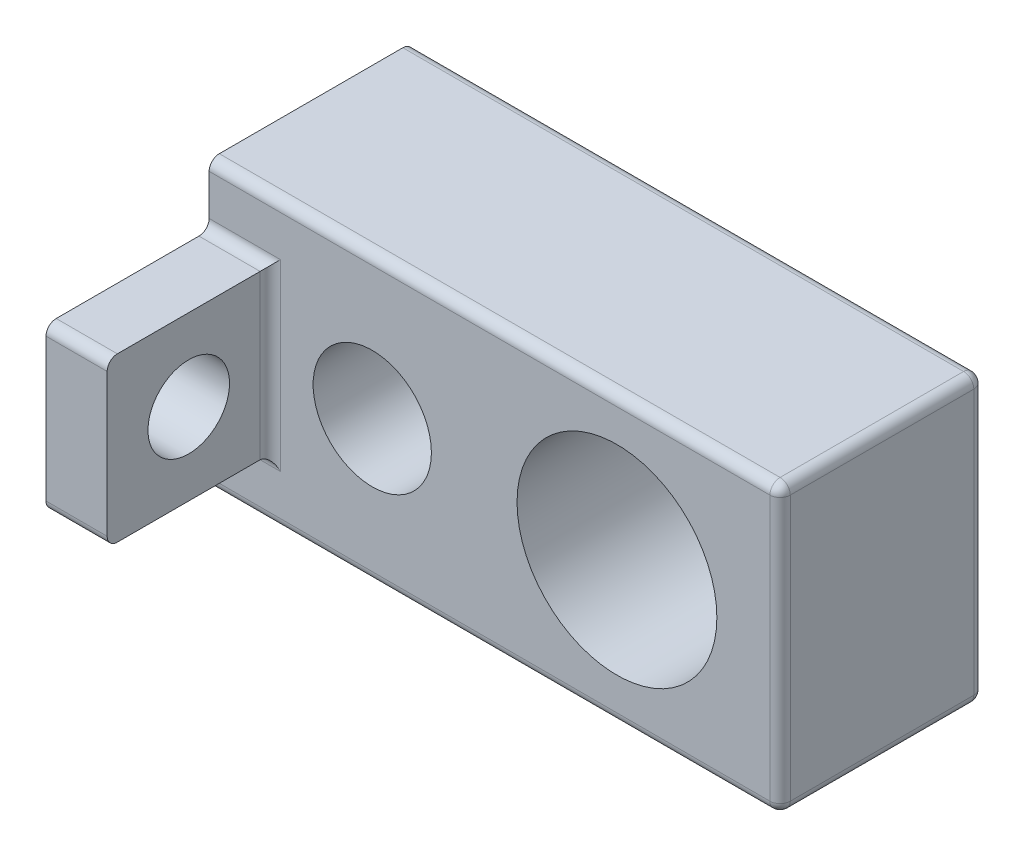
ISO-10303-21;
HEADER;
FILE_DESCRIPTION(('STEP AP214'),'2;1');
FILE_NAME('part.step','',(''),(''),'','','');
FILE_SCHEMA(('AUTOMOTIVE_DESIGN { 1 0 10303 214 1 1 1 1 }'));
ENDSEC;
DATA;
#1=APPLICATION_CONTEXT('core data for automotive mechanical design processes');
#2=APPLICATION_PROTOCOL_DEFINITION('international standard','automotive_design',2000,#1);
#3=PRODUCT_CONTEXT('',#1,'mechanical');
#4=PRODUCT('Part','Part','',(#3));
#5=PRODUCT_RELATED_PRODUCT_CATEGORY('part','',(#4));
#6=PRODUCT_DEFINITION_FORMATION('','',#4);
#7=PRODUCT_DEFINITION_CONTEXT('part definition',#1,'design');
#8=PRODUCT_DEFINITION('design','',#6,#7);
#9=PRODUCT_DEFINITION_SHAPE('','',#8);
#10=(LENGTH_UNIT() NAMED_UNIT(*) SI_UNIT(.MILLI.,.METRE.));
#11=(NAMED_UNIT(*) PLANE_ANGLE_UNIT() SI_UNIT($,.RADIAN.));
#12=(NAMED_UNIT(*) SI_UNIT($,.STERADIAN.) SOLID_ANGLE_UNIT());
#13=UNCERTAINTY_MEASURE_WITH_UNIT(LENGTH_MEASURE(1.E-05),#10,'distance_accuracy_value','');
#14=(GEOMETRIC_REPRESENTATION_CONTEXT(3) GLOBAL_UNCERTAINTY_ASSIGNED_CONTEXT((#13)) GLOBAL_UNIT_ASSIGNED_CONTEXT((#10,
#11,#12)) REPRESENTATION_CONTEXT('',''));
#15=CARTESIAN_POINT('',(0.,0.,0.));
#16=DIRECTION('',(0.,0.,1.));
#17=DIRECTION('',(1.,0.,0.));
#18=AXIS2_PLACEMENT_3D('',#15,#16,#17);
#19=CARTESIAN_POINT('',(-7.,-3.5,5.));
#20=DIRECTION('',(1.,0.,0.));
#21=DIRECTION('',(0.,0.,-1.));
#22=AXIS2_PLACEMENT_3D('',#19,#20,#21);
#23=PLANE('',#22);
#24=CARTESIAN_POINT('',(-7.,0.,7.));
#25=DIRECTION('',(1.,0.,0.));
#26=DIRECTION('',(0.,0.,-1.));
#27=AXIS2_PLACEMENT_3D('',#24,#25,#26);
#28=CIRCLE('',#27,1.);
#29=CARTESIAN_POINT('',(-7.,0.,6.));
#30=VERTEX_POINT('',#29);
#31=EDGE_CURVE('E409',#30,#30,#28,.T.);
#32=ORIENTED_EDGE('',*,*,#31,.T.);
#33=EDGE_LOOP('',(#32));
#34=FACE_BOUND('',#33,.T.);
#35=DIRECTION('',(0.,-1.,0.));
#36=VECTOR('',#35,1.);
#37=CARTESIAN_POINT('',(-7.,-3.5,0.));
#38=LINE('',#37,#36);
#39=CARTESIAN_POINT('',(-7.,3.25,0.));
#40=VERTEX_POINT('',#39);
#41=CARTESIAN_POINT('',(-7.,-3.25,0.));
#42=VERTEX_POINT('',#41);
#43=EDGE_CURVE('E344',#40,#42,#38,.T.);
#44=ORIENTED_EDGE('',*,*,#43,.T.);
#45=CARTESIAN_POINT('',(-7.,-3.25,0.25));
#46=DIRECTION('',(1.,0.,0.));
#47=DIRECTION('',(0.,0.,-1.));
#48=AXIS2_PLACEMENT_3D('',#45,#46,#47);
#49=CIRCLE('',#48,0.25);
#50=CARTESIAN_POINT('',(-7.,-3.5,0.25));
#51=VERTEX_POINT('',#50);
#52=EDGE_CURVE('E188',#42,#51,#49,.F.);
#53=ORIENTED_EDGE('',*,*,#52,.T.);
#54=DIRECTION('',(0.,0.,-1.));
#55=VECTOR('',#54,1.);
#56=CARTESIAN_POINT('',(-7.,-3.5,5.));
#57=LINE('',#56,#55);
#58=CARTESIAN_POINT('',(-7.,-3.5,4.75));
#59=VERTEX_POINT('',#58);
#60=EDGE_CURVE('E171',#59,#51,#57,.T.);
#61=ORIENTED_EDGE('',*,*,#60,.F.);
#62=CARTESIAN_POINT('',(-7.,-3.25,4.75));
#63=DIRECTION('',(1.,0.,0.));
#64=DIRECTION('',(0.,0.,-1.));
#65=AXIS2_PLACEMENT_3D('',#62,#63,#64);
#66=CIRCLE('',#65,0.25);
#67=CARTESIAN_POINT('',(-7.,-3.25,5.));
#68=VERTEX_POINT('',#67);
#69=EDGE_CURVE('E185',#59,#68,#66,.F.);
#70=ORIENTED_EDGE('',*,*,#69,.T.);
#71=DIRECTION('',(0.,-1.,0.));
#72=VECTOR('',#71,1.);
#73=CARTESIAN_POINT('',(-7.,-3.5,5.));
#74=LINE('',#73,#72);
#75=CARTESIAN_POINT('',(-7.,-2.25,5.));
#76=VERTEX_POINT('',#75);
#77=EDGE_CURVE('E339',#76,#68,#74,.T.);
#78=ORIENTED_EDGE('',*,*,#77,.F.);
#79=CARTESIAN_POINT('',(-7.,-2.25,5.25));
#80=DIRECTION('',(1.,0.,0.));
#81=DIRECTION('',(0.,0.,-1.));
#82=AXIS2_PLACEMENT_3D('',#79,#80,#81);
#83=CIRCLE('',#82,0.25);
#84=CARTESIAN_POINT('',(-7.,-2.,5.25));
#85=VERTEX_POINT('',#84);
#86=EDGE_CURVE('E11',#76,#85,#83,.T.);
#87=ORIENTED_EDGE('',*,*,#86,.T.);
#88=DIRECTION('',(0.,0.,1.));
#89=VECTOR('',#88,1.);
#90=CARTESIAN_POINT('',(-7.,-2.,5.));
#91=LINE('',#90,#89);
#92=CARTESIAN_POINT('',(-7.,-2.,8.75));
#93=VERTEX_POINT('',#92);
#94=EDGE_CURVE('E380',#85,#93,#91,.T.);
#95=ORIENTED_EDGE('',*,*,#94,.T.);
#96=CARTESIAN_POINT('',(-7.,-1.75,8.75));
#97=DIRECTION('',(1.,0.,0.));
#98=DIRECTION('',(0.,0.,-1.));
#99=AXIS2_PLACEMENT_3D('',#96,#97,#98);
#100=CIRCLE('',#99,0.25);
#101=CARTESIAN_POINT('',(-7.,-1.75,9.));
#102=VERTEX_POINT('',#101);
#103=EDGE_CURVE('E202',#93,#102,#100,.F.);
#104=ORIENTED_EDGE('',*,*,#103,.T.);
#105=DIRECTION('',(0.,1.,0.));
#106=VECTOR('',#105,1.);
#107=CARTESIAN_POINT('',(-7.,-2.,9.));
#108=LINE('',#107,#106);
#109=CARTESIAN_POINT('',(-7.,1.75,9.));
#110=VERTEX_POINT('',#109);
#111=EDGE_CURVE('E379',#102,#110,#108,.T.);
#112=ORIENTED_EDGE('',*,*,#111,.T.);
#113=CARTESIAN_POINT('',(-7.,1.75,8.75));
#114=DIRECTION('',(1.,0.,0.));
#115=DIRECTION('',(0.,0.,-1.));
#116=AXIS2_PLACEMENT_3D('',#113,#114,#115);
#117=CIRCLE('',#116,0.25);
#118=CARTESIAN_POINT('',(-7.,2.,8.75));
#119=VERTEX_POINT('',#118);
#120=EDGE_CURVE('E374',#110,#119,#117,.F.);
#121=ORIENTED_EDGE('',*,*,#120,.T.);
#122=DIRECTION('',(0.,0.,-1.));
#123=VECTOR('',#122,1.);
#124=CARTESIAN_POINT('',(-7.,2.,5.));
#125=LINE('',#124,#123);
#126=CARTESIAN_POINT('',(-7.,2.,5.25));
#127=VERTEX_POINT('',#126);
#128=EDGE_CURVE('E390',#119,#127,#125,.T.);
#129=ORIENTED_EDGE('',*,*,#128,.T.);
#130=CARTESIAN_POINT('',(-7.,2.25,5.25));
#131=DIRECTION('',(1.,0.,0.));
#132=DIRECTION('',(0.,0.,-1.));
#133=AXIS2_PLACEMENT_3D('',#130,#131,#132);
#134=CIRCLE('',#133,0.25);
#135=CARTESIAN_POINT('',(-7.,2.25,5.));
#136=VERTEX_POINT('',#135);
#137=EDGE_CURVE('E48',#127,#136,#134,.T.);
#138=ORIENTED_EDGE('',*,*,#137,.T.);
#139=CARTESIAN_POINT('',(-7.,3.25,5.));
#140=VERTEX_POINT('',#139);
#141=EDGE_CURVE('E343',#140,#136,#74,.T.);
#142=ORIENTED_EDGE('',*,*,#141,.F.);
#143=CARTESIAN_POINT('',(-7.,3.25,4.75));
#144=DIRECTION('',(1.,0.,0.));
#145=DIRECTION('',(0.,0.,-1.));
#146=AXIS2_PLACEMENT_3D('',#143,#144,#145);
#147=CIRCLE('',#146,0.25);
#148=CARTESIAN_POINT('',(-7.,3.5,4.75));
#149=VERTEX_POINT('',#148);
#150=EDGE_CURVE('E371',#140,#149,#147,.F.);
#151=ORIENTED_EDGE('',*,*,#150,.T.);
#152=DIRECTION('',(0.,0.,-1.));
#153=VECTOR('',#152,1.);
#154=CARTESIAN_POINT('',(-7.,3.5,5.));
#155=LINE('',#154,#153);
#156=CARTESIAN_POINT('',(-7.,3.5,0.25));
#157=VERTEX_POINT('',#156);
#158=EDGE_CURVE('E190',#149,#157,#155,.T.);
#159=ORIENTED_EDGE('',*,*,#158,.T.);
#160=CARTESIAN_POINT('',(-7.,3.25,0.25));
#161=DIRECTION('',(1.,0.,0.));
#162=DIRECTION('',(0.,0.,-1.));
#163=AXIS2_PLACEMENT_3D('',#160,#161,#162);
#164=CIRCLE('',#163,0.25);
#165=EDGE_CURVE('E196',#157,#40,#164,.F.);
#166=ORIENTED_EDGE('',*,*,#165,.T.);
#167=EDGE_LOOP('',(#44,#53,#61,#70,#78,#87,#95,#104,#112,#121,#129,#138,#142,#151,#159,#166));
#168=FACE_BOUND('',#167,.T.);
#169=ADVANCED_FACE('F38',(#34,#168),#23,.F.);
#170=CARTESIAN_POINT('',(7.,-3.5,5.));
#171=DIRECTION('',(0.,1.,0.));
#172=DIRECTION('',(-1.,0.,0.));
#173=AXIS2_PLACEMENT_3D('',#170,#171,#172);
#174=PLANE('',#173);
#175=ORIENTED_EDGE('',*,*,#60,.T.);
#176=DIRECTION('',(1.,0.,0.));
#177=VECTOR('',#176,1.);
#178=CARTESIAN_POINT('',(7.,-3.5,0.25));
#179=LINE('',#178,#177);
#180=CARTESIAN_POINT('',(6.75,-3.5,0.25));
#181=VERTEX_POINT('',#180);
#182=EDGE_CURVE('E180',#51,#181,#179,.T.);
#183=ORIENTED_EDGE('',*,*,#182,.T.);
#184=DIRECTION('',(0.,0.,-1.));
#185=VECTOR('',#184,1.);
#186=CARTESIAN_POINT('',(6.75,-3.5,5.));
#187=LINE('',#186,#185);
#188=CARTESIAN_POINT('',(6.75,-3.5,4.75));
#189=VERTEX_POINT('',#188);
#190=EDGE_CURVE('E174',#181,#189,#187,.F.);
#191=ORIENTED_EDGE('',*,*,#190,.T.);
#192=DIRECTION('',(1.,0.,0.));
#193=VECTOR('',#192,1.);
#194=CARTESIAN_POINT('',(-7.,-3.5,4.75));
#195=LINE('',#194,#193);
#196=EDGE_CURVE('E167',#189,#59,#195,.F.);
#197=ORIENTED_EDGE('',*,*,#196,.T.);
#198=EDGE_LOOP('',(#175,#183,#191,#197));
#199=FACE_BOUND('',#198,.T.);
#200=ADVANCED_FACE('F169',(#199),#174,.F.);
#201=CARTESIAN_POINT('',(7.,-3.5,5.));
#202=DIRECTION('',(-1.,0.,0.));
#203=DIRECTION('',(0.,0.,1.));
#204=AXIS2_PLACEMENT_3D('',#201,#202,#203);
#205=PLANE('',#204);
#206=DIRECTION('',(0.,1.,0.));
#207=VECTOR('',#206,1.);
#208=CARTESIAN_POINT('',(7.,-3.5,4.75));
#209=LINE('',#208,#207);
#210=CARTESIAN_POINT('',(7.,3.25,4.75));
#211=VERTEX_POINT('',#210);
#212=CARTESIAN_POINT('',(7.,-3.25,4.75));
#213=VERTEX_POINT('',#212);
#214=EDGE_CURVE('E228',#211,#213,#209,.F.);
#215=ORIENTED_EDGE('',*,*,#214,.T.);
#216=DIRECTION('',(0.,0.,-1.));
#217=VECTOR('',#216,1.);
#218=CARTESIAN_POINT('',(7.,-3.25,5.));
#219=LINE('',#218,#217);
#220=CARTESIAN_POINT('',(7.,-3.25,0.25));
#221=VERTEX_POINT('',#220);
#222=EDGE_CURVE('E231',#213,#221,#219,.T.);
#223=ORIENTED_EDGE('',*,*,#222,.T.);
#224=DIRECTION('',(0.,1.,0.));
#225=VECTOR('',#224,1.);
#226=CARTESIAN_POINT('',(7.,-3.5,0.25));
#227=LINE('',#226,#225);
#228=CARTESIAN_POINT('',(7.,3.25,0.25));
#229=VERTEX_POINT('',#228);
#230=EDGE_CURVE('E225',#221,#229,#227,.T.);
#231=ORIENTED_EDGE('',*,*,#230,.T.);
#232=DIRECTION('',(0.,0.,-1.));
#233=VECTOR('',#232,1.);
#234=CARTESIAN_POINT('',(7.,3.25,5.));
#235=LINE('',#234,#233);
#236=EDGE_CURVE('E222',#229,#211,#235,.F.);
#237=ORIENTED_EDGE('',*,*,#236,.T.);
#238=EDGE_LOOP('',(#215,#223,#231,#237));
#239=FACE_BOUND('',#238,.T.);
#240=ADVANCED_FACE('F454',(#239),#205,.F.);
#241=CARTESIAN_POINT('',(7.,3.5,5.));
#242=DIRECTION('',(0.,-1.,0.));
#243=DIRECTION('',(1.,0.,0.));
#244=AXIS2_PLACEMENT_3D('',#241,#242,#243);
#245=PLANE('',#244);
#246=DIRECTION('',(0.,0.,-1.));
#247=VECTOR('',#246,1.);
#248=CARTESIAN_POINT('',(6.75,3.5,5.));
#249=LINE('',#248,#247);
#250=CARTESIAN_POINT('',(6.75,3.5,4.75));
#251=VERTEX_POINT('',#250);
#252=CARTESIAN_POINT('',(6.75,3.5,0.25));
#253=VERTEX_POINT('',#252);
#254=EDGE_CURVE('E238',#251,#253,#249,.T.);
#255=ORIENTED_EDGE('',*,*,#254,.T.);
#256=DIRECTION('',(-1.,0.,0.));
#257=VECTOR('',#256,1.);
#258=CARTESIAN_POINT('',(7.,3.5,0.25));
#259=LINE('',#258,#257);
#260=EDGE_CURVE('E241',#253,#157,#259,.T.);
#261=ORIENTED_EDGE('',*,*,#260,.T.);
#262=ORIENTED_EDGE('',*,*,#158,.F.);
#263=DIRECTION('',(-1.,0.,0.));
#264=VECTOR('',#263,1.);
#265=CARTESIAN_POINT('',(7.,3.5,4.75));
#266=LINE('',#265,#264);
#267=EDGE_CURVE('E235',#149,#251,#266,.F.);
#268=ORIENTED_EDGE('',*,*,#267,.T.);
#269=EDGE_LOOP('',(#255,#261,#262,#268));
#270=FACE_BOUND('',#269,.T.);
#271=ADVANCED_FACE('F632',(#270),#245,.F.);
#272=CARTESIAN_POINT('',(0.,0.,5.));
#273=DIRECTION('',(0.,0.,1.));
#274=DIRECTION('',(1.,0.,0.));
#275=AXIS2_PLACEMENT_3D('',#272,#273,#274);
#276=PLANE('',#275);
#277=ORIENTED_EDGE('',*,*,#77,.T.);
#278=DIRECTION('',(1.,0.,0.));
#279=VECTOR('',#278,1.);
#280=CARTESIAN_POINT('',(7.,-3.25,5.));
#281=LINE('',#280,#279);
#282=CARTESIAN_POINT('',(6.75,-3.25,5.));
#283=VERTEX_POINT('',#282);
#284=EDGE_CURVE('E194',#68,#283,#281,.T.);
#285=ORIENTED_EDGE('',*,*,#284,.T.);
#286=DIRECTION('',(0.,1.,0.));
#287=VECTOR('',#286,1.);
#288=CARTESIAN_POINT('',(6.75,3.5,5.));
#289=LINE('',#288,#287);
#290=CARTESIAN_POINT('',(6.75,3.25,5.));
#291=VERTEX_POINT('',#290);
#292=EDGE_CURVE('E217',#283,#291,#289,.T.);
#293=ORIENTED_EDGE('',*,*,#292,.T.);
#294=DIRECTION('',(-1.,0.,0.));
#295=VECTOR('',#294,1.);
#296=CARTESIAN_POINT('',(-7.,3.25,5.));
#297=LINE('',#296,#295);
#298=EDGE_CURVE('E214',#291,#140,#297,.T.);
#299=ORIENTED_EDGE('',*,*,#298,.T.);
#300=ORIENTED_EDGE('',*,*,#141,.T.);
#301=DIRECTION('',(-1.,0.,0.));
#302=VECTOR('',#301,1.);
#303=CARTESIAN_POINT('',(-5.5,2.25,5.));
#304=LINE('',#303,#302);
#305=CARTESIAN_POINT('',(-5.25,2.25,5.));
#306=VERTEX_POINT('',#305);
#307=EDGE_CURVE('E211',#136,#306,#304,.F.);
#308=ORIENTED_EDGE('',*,*,#307,.T.);
#309=DIRECTION('',(0.,-1.,0.));
#310=VECTOR('',#309,1.);
#311=CARTESIAN_POINT('',(-5.25,-2.,5.));
#312=LINE('',#311,#310);
#313=CARTESIAN_POINT('',(-5.25,-2.25,5.));
#314=VERTEX_POINT('',#313);
#315=EDGE_CURVE('E200',#306,#314,#312,.T.);
#316=ORIENTED_EDGE('',*,*,#315,.T.);
#317=DIRECTION('',(-1.,0.,0.));
#318=VECTOR('',#317,1.);
#319=CARTESIAN_POINT('',(-7.,-2.25,5.));
#320=LINE('',#319,#318);
#321=EDGE_CURVE('E208',#314,#76,#320,.T.);
#322=ORIENTED_EDGE('',*,*,#321,.T.);
#323=EDGE_LOOP('',(#277,#285,#293,#299,#300,#308,#316,#322));
#324=FACE_BOUND('',#323,.T.);
#325=CARTESIAN_POINT('',(3.00000000000002,0.,5.));
#326=DIRECTION('',(0.,0.,1.));
#327=DIRECTION('',(1.,0.,0.));
#328=AXIS2_PLACEMENT_3D('',#325,#326,#327);
#329=CIRCLE('',#328,2.45);
#330=CARTESIAN_POINT('',(5.45000000000002,0.,5.));
#331=VERTEX_POINT('',#330);
#332=EDGE_CURVE('E349',#331,#331,#329,.T.);
#333=ORIENTED_EDGE('',*,*,#332,.F.);
#334=EDGE_LOOP('',(#333));
#335=FACE_BOUND('',#334,.T.);
#336=CARTESIAN_POINT('',(-3.,0.,5.));
#337=DIRECTION('',(0.,0.,1.));
#338=DIRECTION('',(1.,0.,0.));
#339=AXIS2_PLACEMENT_3D('',#336,#337,#338);
#340=CIRCLE('',#339,1.45);
#341=CARTESIAN_POINT('',(-1.55,0.,5.));
#342=VERTEX_POINT('',#341);
#343=EDGE_CURVE('E422',#342,#342,#340,.T.);
#344=ORIENTED_EDGE('',*,*,#343,.F.);
#345=EDGE_LOOP('',(#344));
#346=FACE_BOUND('',#345,.T.);
#347=ADVANCED_FACE('F337',(#324,#335,#346),#276,.T.);
#348=CARTESIAN_POINT('',(0.,0.,0.));
#349=DIRECTION('',(0.,0.,1.));
#350=DIRECTION('',(1.,0.,0.));
#351=AXIS2_PLACEMENT_3D('',#348,#349,#350);
#352=PLANE('',#351);
#353=CARTESIAN_POINT('',(3.00000000000002,0.,0.));
#354=DIRECTION('',(0.,0.,1.));
#355=DIRECTION('',(1.,0.,0.));
#356=AXIS2_PLACEMENT_3D('',#353,#354,#355);
#357=CIRCLE('',#356,2.45);
#358=CARTESIAN_POINT('',(5.45000000000002,0.,0.));
#359=VERTEX_POINT('',#358);
#360=EDGE_CURVE('E419',#359,#359,#357,.T.);
#361=ORIENTED_EDGE('',*,*,#360,.T.);
#362=EDGE_LOOP('',(#361));
#363=FACE_BOUND('',#362,.T.);
#364=CARTESIAN_POINT('',(-3.,0.,0.));
#365=DIRECTION('',(0.,0.,1.));
#366=DIRECTION('',(1.,0.,0.));
#367=AXIS2_PLACEMENT_3D('',#364,#365,#366);
#368=CIRCLE('',#367,1.45);
#369=CARTESIAN_POINT('',(-1.55,0.,0.));
#370=VERTEX_POINT('',#369);
#371=EDGE_CURVE('E352',#370,#370,#368,.T.);
#372=ORIENTED_EDGE('',*,*,#371,.T.);
#373=EDGE_LOOP('',(#372));
#374=FACE_BOUND('',#373,.T.);
#375=DIRECTION('',(0.,1.,0.));
#376=VECTOR('',#375,1.);
#377=CARTESIAN_POINT('',(6.75,0.,0.));
#378=LINE('',#377,#376);
#379=CARTESIAN_POINT('',(6.75,3.25,0.));
#380=VERTEX_POINT('',#379);
#381=CARTESIAN_POINT('',(6.75,-3.25,0.));
#382=VERTEX_POINT('',#381);
#383=EDGE_CURVE('E365',#380,#382,#378,.F.);
#384=ORIENTED_EDGE('',*,*,#383,.T.);
#385=DIRECTION('',(1.,0.,0.));
#386=VECTOR('',#385,1.);
#387=CARTESIAN_POINT('',(0.,-3.25,0.));
#388=LINE('',#387,#386);
#389=EDGE_CURVE('E368',#382,#42,#388,.F.);
#390=ORIENTED_EDGE('',*,*,#389,.T.);
#391=ORIENTED_EDGE('',*,*,#43,.F.);
#392=DIRECTION('',(-1.,0.,0.));
#393=VECTOR('',#392,1.);
#394=CARTESIAN_POINT('',(0.,3.25,0.));
#395=LINE('',#394,#393);
#396=EDGE_CURVE('E362',#40,#380,#395,.F.);
#397=ORIENTED_EDGE('',*,*,#396,.T.);
#398=EDGE_LOOP('',(#384,#390,#391,#397));
#399=FACE_BOUND('',#398,.T.);
#400=ADVANCED_FACE('F431',(#363,#374,#399),#352,.F.);
#401=CARTESIAN_POINT('',(-3.,0.,5.));
#402=DIRECTION('',(0.,0.,-1.));
#403=DIRECTION('',(-1.,0.,0.));
#404=AXIS2_PLACEMENT_3D('',#401,#402,#403);
#405=CYLINDRICAL_SURFACE('',#404,1.45);
#406=ORIENTED_EDGE('',*,*,#343,.T.);
#407=EDGE_LOOP('',(#406));
#408=FACE_BOUND('',#407,.T.);
#409=ORIENTED_EDGE('',*,*,#371,.F.);
#410=EDGE_LOOP('',(#409));
#411=FACE_BOUND('',#410,.T.);
#412=ADVANCED_FACE('F434',(#408,#411),#405,.F.);
#413=CARTESIAN_POINT('',(3.00000000000002,0.,5.));
#414=DIRECTION('',(0.,0.,-1.));
#415=DIRECTION('',(-1.,0.,0.));
#416=AXIS2_PLACEMENT_3D('',#413,#414,#415);
#417=CYLINDRICAL_SURFACE('',#416,2.45);
#418=ORIENTED_EDGE('',*,*,#332,.T.);
#419=EDGE_LOOP('',(#418));
#420=FACE_BOUND('',#419,.T.);
#421=ORIENTED_EDGE('',*,*,#360,.F.);
#422=EDGE_LOOP('',(#421));
#423=FACE_BOUND('',#422,.T.);
#424=ADVANCED_FACE('F436',(#420,#423),#417,.F.);
#425=CARTESIAN_POINT('',(-5.5,2.,5.));
#426=DIRECTION('',(0.,1.,0.));
#427=DIRECTION('',(0.,0.,1.));
#428=AXIS2_PLACEMENT_3D('',#425,#426,#427);
#429=PLANE('',#428);
#430=ORIENTED_EDGE('',*,*,#128,.F.);
#431=DIRECTION('',(-1.,0.,0.));
#432=VECTOR('',#431,1.);
#433=CARTESIAN_POINT('',(-5.5,2.,8.75));
#434=LINE('',#433,#432);
#435=CARTESIAN_POINT('',(-5.5,2.,8.75));
#436=VERTEX_POINT('',#435);
#437=EDGE_CURVE('E63',#119,#436,#434,.F.);
#438=ORIENTED_EDGE('',*,*,#437,.T.);
#439=DIRECTION('',(0.,0.,-1.));
#440=VECTOR('',#439,1.);
#441=CARTESIAN_POINT('',(-5.5,2.,5.));
#442=LINE('',#441,#440);
#443=CARTESIAN_POINT('',(-5.5,2.,5.25));
#444=VERTEX_POINT('',#443);
#445=EDGE_CURVE('E404',#436,#444,#442,.T.);
#446=ORIENTED_EDGE('',*,*,#445,.T.);
#447=DIRECTION('',(-1.,0.,0.));
#448=VECTOR('',#447,1.);
#449=CARTESIAN_POINT('',(-7.,2.,5.25));
#450=LINE('',#449,#448);
#451=EDGE_CURVE('E266',#444,#127,#450,.T.);
#452=ORIENTED_EDGE('',*,*,#451,.T.);
#453=EDGE_LOOP('',(#430,#438,#446,#452));
#454=FACE_BOUND('',#453,.T.);
#455=ADVANCED_FACE('F442',(#454),#429,.T.);
#456=CARTESIAN_POINT('',(-5.5,-2.,9.));
#457=DIRECTION('',(0.,0.,1.));
#458=DIRECTION('',(1.,0.,0.));
#459=AXIS2_PLACEMENT_3D('',#456,#457,#458);
#460=PLANE('',#459);
#461=ORIENTED_EDGE('',*,*,#111,.F.);
#462=DIRECTION('',(-1.,0.,0.));
#463=VECTOR('',#462,1.);
#464=CARTESIAN_POINT('',(-5.5,-1.75,9.));
#465=LINE('',#464,#463);
#466=CARTESIAN_POINT('',(-5.5,-1.75,9.));
#467=VERTEX_POINT('',#466);
#468=EDGE_CURVE('E255',#102,#467,#465,.F.);
#469=ORIENTED_EDGE('',*,*,#468,.T.);
#470=DIRECTION('',(0.,1.,0.));
#471=VECTOR('',#470,1.);
#472=CARTESIAN_POINT('',(-5.5,-2.,9.));
#473=LINE('',#472,#471);
#474=CARTESIAN_POINT('',(-5.5,1.75,9.));
#475=VERTEX_POINT('',#474);
#476=EDGE_CURVE('E397',#467,#475,#473,.T.);
#477=ORIENTED_EDGE('',*,*,#476,.T.);
#478=DIRECTION('',(-1.,0.,0.));
#479=VECTOR('',#478,1.);
#480=CARTESIAN_POINT('',(-5.5,1.75,9.));
#481=LINE('',#480,#479);
#482=EDGE_CURVE('E251',#475,#110,#481,.T.);
#483=ORIENTED_EDGE('',*,*,#482,.T.);
#484=EDGE_LOOP('',(#461,#469,#477,#483));
#485=FACE_BOUND('',#484,.T.);
#486=ADVANCED_FACE('F385',(#485),#460,.T.);
#487=CARTESIAN_POINT('',(-5.5,-2.,5.));
#488=DIRECTION('',(0.,-1.,0.));
#489=DIRECTION('',(0.,0.,-1.));
#490=AXIS2_PLACEMENT_3D('',#487,#488,#489);
#491=PLANE('',#490);
#492=DIRECTION('',(0.,0.,1.));
#493=VECTOR('',#492,1.);
#494=CARTESIAN_POINT('',(-5.5,-2.,5.));
#495=LINE('',#494,#493);
#496=CARTESIAN_POINT('',(-5.5,-2.,5.25));
#497=VERTEX_POINT('',#496);
#498=CARTESIAN_POINT('',(-5.5,-2.,8.75));
#499=VERTEX_POINT('',#498);
#500=EDGE_CURVE('E396',#497,#499,#495,.T.);
#501=ORIENTED_EDGE('',*,*,#500,.T.);
#502=DIRECTION('',(-1.,0.,0.));
#503=VECTOR('',#502,1.);
#504=CARTESIAN_POINT('',(-5.5,-2.,8.75));
#505=LINE('',#504,#503);
#506=EDGE_CURVE('E247',#499,#93,#505,.T.);
#507=ORIENTED_EDGE('',*,*,#506,.T.);
#508=ORIENTED_EDGE('',*,*,#94,.F.);
#509=DIRECTION('',(-1.,0.,0.));
#510=VECTOR('',#509,1.);
#511=CARTESIAN_POINT('',(-5.5,-2.,5.25));
#512=LINE('',#511,#510);
#513=EDGE_CURVE('E244',#85,#497,#512,.F.);
#514=ORIENTED_EDGE('',*,*,#513,.T.);
#515=EDGE_LOOP('',(#501,#507,#508,#514));
#516=FACE_BOUND('',#515,.T.);
#517=ADVANCED_FACE('F399',(#516),#491,.T.);
#518=CARTESIAN_POINT('',(-5.5,0.,0.));
#519=DIRECTION('',(1.,0.,0.));
#520=DIRECTION('',(0.,0.,-1.));
#521=AXIS2_PLACEMENT_3D('',#518,#519,#520);
#522=PLANE('',#521);
#523=CARTESIAN_POINT('',(-5.5,0.,7.));
#524=DIRECTION('',(1.,0.,0.));
#525=DIRECTION('',(0.,0.,-1.));
#526=AXIS2_PLACEMENT_3D('',#523,#524,#525);
#527=CIRCLE('',#526,1.);
#528=CARTESIAN_POINT('',(-5.5,0.,6.));
#529=VERTEX_POINT('',#528);
#530=EDGE_CURVE('E318',#529,#529,#527,.T.);
#531=ORIENTED_EDGE('',*,*,#530,.F.);
#532=EDGE_LOOP('',(#531));
#533=FACE_BOUND('',#532,.T.);
#534=ORIENTED_EDGE('',*,*,#476,.F.);
#535=CARTESIAN_POINT('',(-5.5,-1.75,8.75));
#536=DIRECTION('',(1.,0.,0.));
#537=DIRECTION('',(0.,0.,-1.));
#538=AXIS2_PLACEMENT_3D('',#535,#536,#537);
#539=CIRCLE('',#538,0.25);
#540=EDGE_CURVE('E263',#467,#499,#539,.T.);
#541=ORIENTED_EDGE('',*,*,#540,.T.);
#542=ORIENTED_EDGE('',*,*,#500,.F.);
#543=DIRECTION('',(0.,-1.,0.));
#544=VECTOR('',#543,1.);
#545=CARTESIAN_POINT('',(-5.5,2.,5.25));
#546=LINE('',#545,#544);
#547=EDGE_CURVE('E56',#497,#444,#546,.F.);
#548=ORIENTED_EDGE('',*,*,#547,.T.);
#549=ORIENTED_EDGE('',*,*,#445,.F.);
#550=CARTESIAN_POINT('',(-5.5,1.75,8.75));
#551=DIRECTION('',(1.,0.,0.));
#552=DIRECTION('',(0.,0.,-1.));
#553=AXIS2_PLACEMENT_3D('',#550,#551,#552);
#554=CIRCLE('',#553,0.25);
#555=EDGE_CURVE('E260',#436,#475,#554,.T.);
#556=ORIENTED_EDGE('',*,*,#555,.T.);
#557=EDGE_LOOP('',(#534,#541,#542,#548,#549,#556));
#558=FACE_BOUND('',#557,.T.);
#559=ADVANCED_FACE('F395',(#533,#558),#522,.T.);
#560=CARTESIAN_POINT('',(-7.5,0.,7.));
#561=DIRECTION('',(1.,0.,0.));
#562=DIRECTION('',(0.,0.,-1.));
#563=AXIS2_PLACEMENT_3D('',#560,#561,#562);
#564=CYLINDRICAL_SURFACE('',#563,1.);
#565=ORIENTED_EDGE('',*,*,#530,.T.);
#566=EDGE_LOOP('',(#565));
#567=FACE_BOUND('',#566,.T.);
#568=ORIENTED_EDGE('',*,*,#31,.F.);
#569=EDGE_LOOP('',(#568));
#570=FACE_BOUND('',#569,.T.);
#571=ADVANCED_FACE('F504',(#567,#570),#564,.F.);
#572=CARTESIAN_POINT('',(0.,3.25,4.75));
#573=DIRECTION('',(1.,0.,0.));
#574=DIRECTION('',(0.,1.,0.));
#575=AXIS2_PLACEMENT_3D('',#572,#573,#574);
#576=CYLINDRICAL_SURFACE('',#575,0.25);
#577=CARTESIAN_POINT('',(6.75,3.25,4.75));
#578=DIRECTION('',(1.,0.,0.));
#579=DIRECTION('',(0.,0.,-1.));
#580=AXIS2_PLACEMENT_3D('',#577,#578,#579);
#581=CIRCLE('',#580,0.25);
#582=EDGE_CURVE('E315',#251,#291,#581,.T.);
#583=ORIENTED_EDGE('',*,*,#582,.F.);
#584=ORIENTED_EDGE('',*,*,#267,.F.);
#585=ORIENTED_EDGE('',*,*,#150,.F.);
#586=ORIENTED_EDGE('',*,*,#298,.F.);
#587=EDGE_LOOP('',(#583,#584,#585,#586));
#588=FACE_BOUND('',#587,.T.);
#589=ADVANCED_FACE('F500',(#588),#576,.T.);
#590=CARTESIAN_POINT('',(6.75,3.25,4.75));
#591=DIRECTION('',(0.,0.,1.));
#592=DIRECTION('',(1.,0.,0.));
#593=AXIS2_PLACEMENT_3D('',#590,#591,#592);
#594=SPHERICAL_SURFACE('',#593,0.25);
#595=CARTESIAN_POINT('',(6.75,3.25,4.75));
#596=DIRECTION('',(0.,0.,1.));
#597=DIRECTION('',(1.,0.,0.));
#598=AXIS2_PLACEMENT_3D('',#595,#596,#597);
#599=CIRCLE('',#598,0.25);
#600=EDGE_CURVE('E307',#251,#211,#599,.F.);
#601=ORIENTED_EDGE('',*,*,#600,.F.);
#602=ORIENTED_EDGE('',*,*,#582,.T.);
#603=CARTESIAN_POINT('',(6.75,3.25,4.75));
#604=DIRECTION('',(0.,1.,0.));
#605=DIRECTION('',(0.,0.,1.));
#606=AXIS2_PLACEMENT_3D('',#603,#604,#605);
#607=CIRCLE('',#606,0.25);
#608=EDGE_CURVE('E311',#211,#291,#607,.F.);
#609=ORIENTED_EDGE('',*,*,#608,.F.);
#610=EDGE_LOOP('',(#601,#602,#609));
#611=FACE_BOUND('',#610,.T.);
#612=ADVANCED_FACE('F497',(#611),#594,.T.);
#613=CARTESIAN_POINT('',(0.,-3.25,4.75));
#614=DIRECTION('',(-1.,0.,0.));
#615=DIRECTION('',(0.,-1.,0.));
#616=AXIS2_PLACEMENT_3D('',#613,#614,#615);
#617=CYLINDRICAL_SURFACE('',#616,0.25);
#618=ORIENTED_EDGE('',*,*,#69,.F.);
#619=ORIENTED_EDGE('',*,*,#196,.F.);
#620=CARTESIAN_POINT('',(6.75,-3.25,4.75));
#621=DIRECTION('',(1.,0.,0.));
#622=DIRECTION('',(0.,0.,-1.));
#623=AXIS2_PLACEMENT_3D('',#620,#621,#622);
#624=CIRCLE('',#623,0.25);
#625=EDGE_CURVE('E304',#283,#189,#624,.T.);
#626=ORIENTED_EDGE('',*,*,#625,.F.);
#627=ORIENTED_EDGE('',*,*,#284,.F.);
#628=EDGE_LOOP('',(#618,#619,#626,#627));
#629=FACE_BOUND('',#628,.T.);
#630=ADVANCED_FACE('F193',(#629),#617,.T.);
#631=CARTESIAN_POINT('',(6.75,0.,4.75));
#632=DIRECTION('',(0.,-1.,0.));
#633=DIRECTION('',(0.,0.,-1.));
#634=AXIS2_PLACEMENT_3D('',#631,#632,#633);
#635=CYLINDRICAL_SURFACE('',#634,0.25);
#636=ORIENTED_EDGE('',*,*,#608,.T.);
#637=ORIENTED_EDGE('',*,*,#292,.F.);
#638=CARTESIAN_POINT('',(6.75,-3.25,4.75));
#639=DIRECTION('',(0.,-1.,0.));
#640=DIRECTION('',(0.,0.,-1.));
#641=AXIS2_PLACEMENT_3D('',#638,#639,#640);
#642=CIRCLE('',#641,0.25);
#643=EDGE_CURVE('E300',#213,#283,#642,.T.);
#644=ORIENTED_EDGE('',*,*,#643,.F.);
#645=ORIENTED_EDGE('',*,*,#214,.F.);
#646=EDGE_LOOP('',(#636,#637,#644,#645));
#647=FACE_BOUND('',#646,.T.);
#648=ADVANCED_FACE('F490',(#647),#635,.T.);
#649=CARTESIAN_POINT('',(6.75,3.25,5.));
#650=DIRECTION('',(0.,0.,-1.));
#651=DIRECTION('',(-1.,0.,0.));
#652=AXIS2_PLACEMENT_3D('',#649,#650,#651);
#653=CYLINDRICAL_SURFACE('',#652,0.25);
#654=ORIENTED_EDGE('',*,*,#600,.T.);
#655=ORIENTED_EDGE('',*,*,#236,.F.);
#656=CARTESIAN_POINT('',(6.75,3.25,0.25));
#657=DIRECTION('',(0.,0.,-1.));
#658=DIRECTION('',(-1.,0.,0.));
#659=AXIS2_PLACEMENT_3D('',#656,#657,#658);
#660=CIRCLE('',#659,0.25);
#661=EDGE_CURVE('E296',#253,#229,#660,.T.);
#662=ORIENTED_EDGE('',*,*,#661,.F.);
#663=ORIENTED_EDGE('',*,*,#254,.F.);
#664=EDGE_LOOP('',(#654,#655,#662,#663));
#665=FACE_BOUND('',#664,.T.);
#666=ADVANCED_FACE('F486',(#665),#653,.T.);
#667=CARTESIAN_POINT('',(7.,3.25,0.25));
#668=DIRECTION('',(-1.,0.,0.));
#669=DIRECTION('',(0.,-1.,0.));
#670=AXIS2_PLACEMENT_3D('',#667,#668,#669);
#671=CYLINDRICAL_SURFACE('',#670,0.25);
#672=ORIENTED_EDGE('',*,*,#165,.F.);
#673=ORIENTED_EDGE('',*,*,#260,.F.);
#674=CARTESIAN_POINT('',(6.75,3.25,0.25));
#675=DIRECTION('',(1.,0.,0.));
#676=DIRECTION('',(0.,0.,-1.));
#677=AXIS2_PLACEMENT_3D('',#674,#675,#676);
#678=CIRCLE('',#677,0.25);
#679=EDGE_CURVE('E292',#380,#253,#678,.T.);
#680=ORIENTED_EDGE('',*,*,#679,.F.);
#681=ORIENTED_EDGE('',*,*,#396,.F.);
#682=EDGE_LOOP('',(#672,#673,#680,#681));
#683=FACE_BOUND('',#682,.T.);
#684=ADVANCED_FACE('F482',(#683),#671,.T.);
#685=CARTESIAN_POINT('',(6.75,-3.25,4.75));
#686=DIRECTION('',(0.,0.,1.));
#687=DIRECTION('',(1.,0.,0.));
#688=AXIS2_PLACEMENT_3D('',#685,#686,#687);
#689=SPHERICAL_SURFACE('',#688,0.25);
#690=ORIENTED_EDGE('',*,*,#643,.T.);
#691=ORIENTED_EDGE('',*,*,#625,.T.);
#692=CARTESIAN_POINT('',(6.75,-3.25,4.75));
#693=DIRECTION('',(0.,0.,1.));
#694=DIRECTION('',(1.,0.,0.));
#695=AXIS2_PLACEMENT_3D('',#692,#693,#694);
#696=CIRCLE('',#695,0.25);
#697=EDGE_CURVE('E288',#213,#189,#696,.F.);
#698=ORIENTED_EDGE('',*,*,#697,.F.);
#699=EDGE_LOOP('',(#690,#691,#698));
#700=FACE_BOUND('',#699,.T.);
#701=ADVANCED_FACE('F478',(#700),#689,.T.);
#702=CARTESIAN_POINT('',(6.75,3.25,0.25));
#703=DIRECTION('',(0.,0.,1.));
#704=DIRECTION('',(1.,0.,0.));
#705=AXIS2_PLACEMENT_3D('',#702,#703,#704);
#706=SPHERICAL_SURFACE('',#705,0.25);
#707=ORIENTED_EDGE('',*,*,#679,.T.);
#708=ORIENTED_EDGE('',*,*,#661,.T.);
#709=CARTESIAN_POINT('',(6.75,3.25,0.25));
#710=DIRECTION('',(0.,1.,0.));
#711=DIRECTION('',(0.,0.,1.));
#712=AXIS2_PLACEMENT_3D('',#709,#710,#711);
#713=CIRCLE('',#712,0.25);
#714=EDGE_CURVE('E284',#380,#229,#713,.F.);
#715=ORIENTED_EDGE('',*,*,#714,.F.);
#716=EDGE_LOOP('',(#707,#708,#715));
#717=FACE_BOUND('',#716,.T.);
#718=ADVANCED_FACE('F474',(#717),#706,.T.);
#719=CARTESIAN_POINT('',(6.75,-3.25,5.));
#720=DIRECTION('',(0.,0.,-1.));
#721=DIRECTION('',(-1.,0.,0.));
#722=AXIS2_PLACEMENT_3D('',#719,#720,#721);
#723=CYLINDRICAL_SURFACE('',#722,0.25);
#724=ORIENTED_EDGE('',*,*,#697,.T.);
#725=ORIENTED_EDGE('',*,*,#190,.F.);
#726=CARTESIAN_POINT('',(6.75,-3.25,0.25));
#727=DIRECTION('',(0.,0.,-1.));
#728=DIRECTION('',(-1.,0.,0.));
#729=AXIS2_PLACEMENT_3D('',#726,#727,#728);
#730=CIRCLE('',#729,0.25);
#731=EDGE_CURVE('E280',#221,#181,#730,.T.);
#732=ORIENTED_EDGE('',*,*,#731,.F.);
#733=ORIENTED_EDGE('',*,*,#222,.F.);
#734=EDGE_LOOP('',(#724,#725,#732,#733));
#735=FACE_BOUND('',#734,.T.);
#736=ADVANCED_FACE('F470',(#735),#723,.T.);
#737=CARTESIAN_POINT('',(6.75,-3.5,0.25));
#738=DIRECTION('',(0.,1.,0.));
#739=DIRECTION('',(0.,0.,1.));
#740=AXIS2_PLACEMENT_3D('',#737,#738,#739);
#741=CYLINDRICAL_SURFACE('',#740,0.25);
#742=ORIENTED_EDGE('',*,*,#714,.T.);
#743=ORIENTED_EDGE('',*,*,#230,.F.);
#744=CARTESIAN_POINT('',(6.75,-3.25,0.25));
#745=DIRECTION('',(0.,-1.,0.));
#746=DIRECTION('',(0.,0.,-1.));
#747=AXIS2_PLACEMENT_3D('',#744,#745,#746);
#748=CIRCLE('',#747,0.25);
#749=EDGE_CURVE('E277',#382,#221,#748,.T.);
#750=ORIENTED_EDGE('',*,*,#749,.F.);
#751=ORIENTED_EDGE('',*,*,#383,.F.);
#752=EDGE_LOOP('',(#742,#743,#750,#751));
#753=FACE_BOUND('',#752,.T.);
#754=ADVANCED_FACE('F466',(#753),#741,.T.);
#755=CARTESIAN_POINT('',(6.75,-3.25,0.25));
#756=DIRECTION('',(0.,0.,1.));
#757=DIRECTION('',(1.,0.,0.));
#758=AXIS2_PLACEMENT_3D('',#755,#756,#757);
#759=SPHERICAL_SURFACE('',#758,0.25);
#760=ORIENTED_EDGE('',*,*,#749,.T.);
#761=ORIENTED_EDGE('',*,*,#731,.T.);
#762=CARTESIAN_POINT('',(6.75,-3.25,0.25));
#763=DIRECTION('',(1.,0.,0.));
#764=DIRECTION('',(0.,0.,-1.));
#765=AXIS2_PLACEMENT_3D('',#762,#763,#764);
#766=CIRCLE('',#765,0.25);
#767=EDGE_CURVE('E274',#382,#181,#766,.F.);
#768=ORIENTED_EDGE('',*,*,#767,.F.);
#769=EDGE_LOOP('',(#760,#761,#768));
#770=FACE_BOUND('',#769,.T.);
#771=ADVANCED_FACE('F462',(#770),#759,.T.);
#772=CARTESIAN_POINT('',(7.,-3.25,0.25));
#773=DIRECTION('',(1.,0.,0.));
#774=DIRECTION('',(0.,1.,0.));
#775=AXIS2_PLACEMENT_3D('',#772,#773,#774);
#776=CYLINDRICAL_SURFACE('',#775,0.25);
#777=ORIENTED_EDGE('',*,*,#52,.F.);
#778=ORIENTED_EDGE('',*,*,#389,.F.);
#779=ORIENTED_EDGE('',*,*,#767,.T.);
#780=ORIENTED_EDGE('',*,*,#182,.F.);
#781=EDGE_LOOP('',(#777,#778,#779,#780));
#782=FACE_BOUND('',#781,.T.);
#783=ADVANCED_FACE('F459',(#782),#776,.T.);
#784=CARTESIAN_POINT('',(-5.5,-1.75,8.75));
#785=DIRECTION('',(-1.,0.,0.));
#786=DIRECTION('',(0.,0.,1.));
#787=AXIS2_PLACEMENT_3D('',#784,#785,#786);
#788=CYLINDRICAL_SURFACE('',#787,0.25);
#789=ORIENTED_EDGE('',*,*,#540,.F.);
#790=ORIENTED_EDGE('',*,*,#468,.F.);
#791=ORIENTED_EDGE('',*,*,#103,.F.);
#792=ORIENTED_EDGE('',*,*,#506,.F.);
#793=EDGE_LOOP('',(#789,#790,#791,#792));
#794=FACE_BOUND('',#793,.T.);
#795=ADVANCED_FACE('F393',(#794),#788,.T.);
#796=CARTESIAN_POINT('',(-5.5,1.75,8.75));
#797=DIRECTION('',(-1.,0.,0.));
#798=DIRECTION('',(0.,0.,1.));
#799=AXIS2_PLACEMENT_3D('',#796,#797,#798);
#800=CYLINDRICAL_SURFACE('',#799,0.25);
#801=ORIENTED_EDGE('',*,*,#555,.F.);
#802=ORIENTED_EDGE('',*,*,#437,.F.);
#803=ORIENTED_EDGE('',*,*,#120,.F.);
#804=ORIENTED_EDGE('',*,*,#482,.F.);
#805=EDGE_LOOP('',(#801,#802,#803,#804));
#806=FACE_BOUND('',#805,.T.);
#807=ADVANCED_FACE('F508',(#806),#800,.T.);
#808=CARTESIAN_POINT('',(0.,-2.25,5.25));
#809=DIRECTION('',(1.,0.,0.));
#810=DIRECTION('',(0.,0.,-1.));
#811=AXIS2_PLACEMENT_3D('',#808,#809,#810);
#812=CYLINDRICAL_SURFACE('',#811,0.25);
#813=ORIENTED_EDGE('',*,*,#86,.F.);
#814=ORIENTED_EDGE('',*,*,#321,.F.);
#815=CARTESIAN_POINT('',(-5.25,-2.25,5.25));
#816=DIRECTION('',(0.707106781186547,0.707106781186547,0.));
#817=DIRECTION('',(-0.707106781186547,0.707106781186547,0.));
#818=AXIS2_PLACEMENT_3D('',#815,#816,#817);
#819=ELLIPSE('',#818,0.353553390593274,0.25);
#820=EDGE_CURVE('E42',#497,#314,#819,.F.);
#821=ORIENTED_EDGE('',*,*,#820,.F.);
#822=ORIENTED_EDGE('',*,*,#513,.F.);
#823=EDGE_LOOP('',(#813,#814,#821,#822));
#824=FACE_BOUND('',#823,.T.);
#825=ADVANCED_FACE('F40',(#824),#812,.F.);
#826=CARTESIAN_POINT('',(-5.25,0.,5.25));
#827=DIRECTION('',(0.,1.,0.));
#828=DIRECTION('',(0.,0.,1.));
#829=AXIS2_PLACEMENT_3D('',#826,#827,#828);
#830=CYLINDRICAL_SURFACE('',#829,0.25);
#831=ORIENTED_EDGE('',*,*,#820,.T.);
#832=ORIENTED_EDGE('',*,*,#315,.F.);
#833=CARTESIAN_POINT('',(-5.25,2.25,5.25));
#834=DIRECTION('',(-0.707106781186547,0.707106781186547,0.));
#835=DIRECTION('',(0.707106781186547,0.707106781186547,0.));
#836=AXIS2_PLACEMENT_3D('',#833,#834,#835);
#837=ELLIPSE('',#836,0.353553390593274,0.25);
#838=EDGE_CURVE('E319',#444,#306,#837,.F.);
#839=ORIENTED_EDGE('',*,*,#838,.F.);
#840=ORIENTED_EDGE('',*,*,#547,.F.);
#841=EDGE_LOOP('',(#831,#832,#839,#840));
#842=FACE_BOUND('',#841,.T.);
#843=ADVANCED_FACE('F331',(#842),#830,.F.);
#844=CARTESIAN_POINT('',(-5.5,2.25,5.25));
#845=DIRECTION('',(1.,0.,0.));
#846=DIRECTION('',(0.,0.,-1.));
#847=AXIS2_PLACEMENT_3D('',#844,#845,#846);
#848=CYLINDRICAL_SURFACE('',#847,0.25);
#849=ORIENTED_EDGE('',*,*,#838,.T.);
#850=ORIENTED_EDGE('',*,*,#307,.F.);
#851=ORIENTED_EDGE('',*,*,#137,.F.);
#852=ORIENTED_EDGE('',*,*,#451,.F.);
#853=EDGE_LOOP('',(#849,#850,#851,#852));
#854=FACE_BOUND('',#853,.T.);
#855=ADVANCED_FACE('F512',(#854),#848,.F.);
#856=CLOSED_SHELL('',(#169,#200,#240,#271,#347,#400,#412,#424,#455,#486,#517,#559,#571,#589,
#612,#630,#648,#666,#684,#701,#718,#736,#754,#771,#783,#795,#807,#825,#843,#855));
#857=MANIFOLD_SOLID_BREP('B2',#856);
#858=ADVANCED_BREP_SHAPE_REPRESENTATION('',(#18,#857),#14);
#859=SHAPE_DEFINITION_REPRESENTATION(#9,#858);
ENDSEC;
END-ISO-10303-21;
